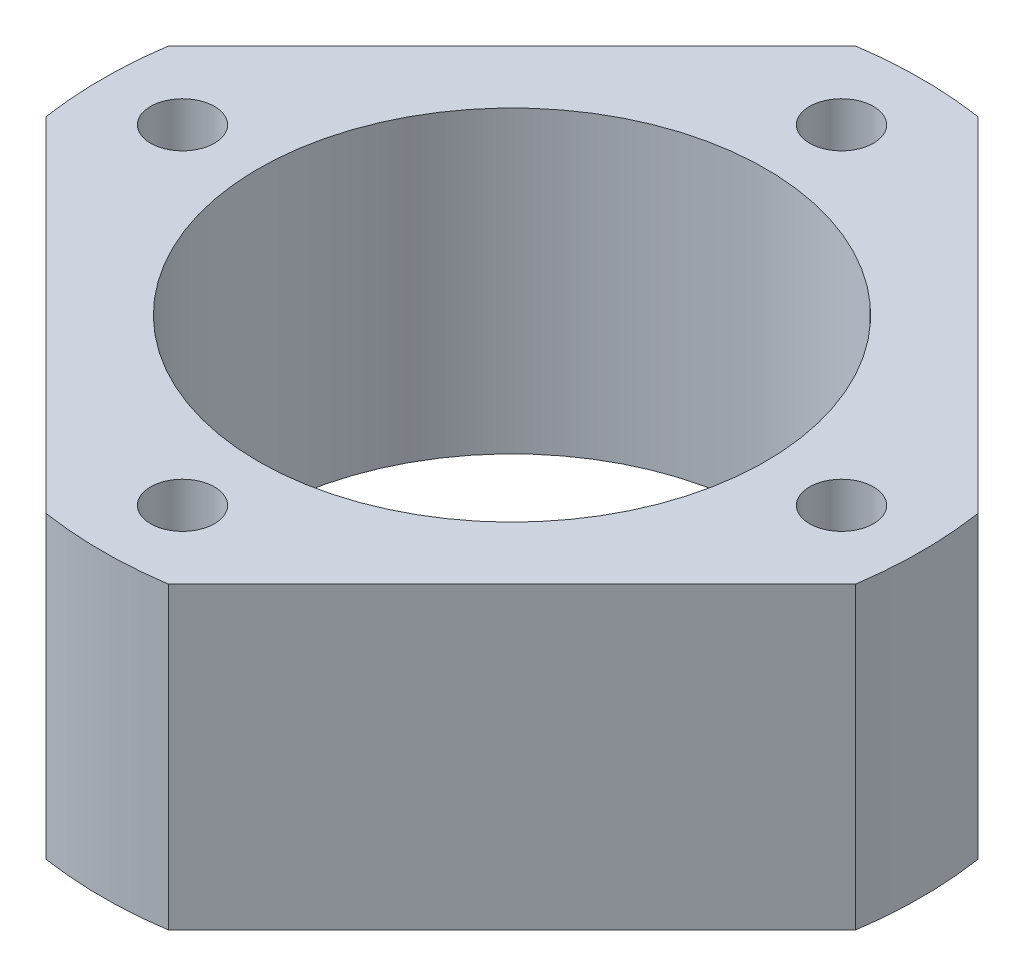
ISO-10303-21;
HEADER;
FILE_DESCRIPTION(('STEP AP214'),'2;1');
FILE_NAME('part.step','',(''),(''),'','','');
FILE_SCHEMA(('AUTOMOTIVE_DESIGN { 1 0 10303 214 1 1 1 1 }'));
ENDSEC;
DATA;
#1=APPLICATION_CONTEXT('core data for automotive mechanical design processes');
#2=APPLICATION_PROTOCOL_DEFINITION('international standard','automotive_design',2000,#1);
#3=PRODUCT_CONTEXT('',#1,'mechanical');
#4=PRODUCT('Part','Part','',(#3));
#5=PRODUCT_RELATED_PRODUCT_CATEGORY('part','',(#4));
#6=PRODUCT_DEFINITION_FORMATION('','',#4);
#7=PRODUCT_DEFINITION_CONTEXT('part definition',#1,'design');
#8=PRODUCT_DEFINITION('design','',#6,#7);
#9=PRODUCT_DEFINITION_SHAPE('','',#8);
#10=(LENGTH_UNIT() NAMED_UNIT(*) SI_UNIT(.MILLI.,.METRE.));
#11=(NAMED_UNIT(*) PLANE_ANGLE_UNIT() SI_UNIT($,.RADIAN.));
#12=(NAMED_UNIT(*) SI_UNIT($,.STERADIAN.) SOLID_ANGLE_UNIT());
#13=UNCERTAINTY_MEASURE_WITH_UNIT(LENGTH_MEASURE(1.E-05),#10,'distance_accuracy_value','');
#14=(GEOMETRIC_REPRESENTATION_CONTEXT(3) GLOBAL_UNCERTAINTY_ASSIGNED_CONTEXT((#13)) GLOBAL_UNIT_ASSIGNED_CONTEXT((#10,
#11,#12)) REPRESENTATION_CONTEXT('',''));
#15=CARTESIAN_POINT('',(0.,0.,0.));
#16=DIRECTION('',(0.,0.,1.));
#17=DIRECTION('',(1.,0.,0.));
#18=AXIS2_PLACEMENT_3D('',#15,#16,#17);
#19=CARTESIAN_POINT('',(11.6672618895781,15.,11.667261889578));
#20=DIRECTION('',(0.707106781186549,0.,0.707106781186546));
#21=DIRECTION('',(0.707106781186546,0.,-0.707106781186549));
#22=AXIS2_PLACEMENT_3D('',#19,#20,#21);
#23=PLANE('',#22);
#24=DIRECTION('',(-0.707106781186546,0.,0.707106781186549));
#25=VECTOR('',#24,1.);
#26=CARTESIAN_POINT('',(11.6672618895781,0.,11.667261889578));
#27=LINE('',#26,#25);
#28=CARTESIAN_POINT('',(20.2695871566207,0.,3.06493662253536));
#29=VERTEX_POINT('',#28);
#30=CARTESIAN_POINT('',(3.06493662253545,0.,20.2695871566207));
#31=VERTEX_POINT('',#30);
#32=EDGE_CURVE('E152',#29,#31,#27,.T.);
#33=ORIENTED_EDGE('',*,*,#32,.F.);
#34=DIRECTION('',(0.,-1.,0.));
#35=VECTOR('',#34,1.);
#36=CARTESIAN_POINT('',(20.2695871566207,15.,3.06493662253536));
#37=LINE('',#36,#35);
#38=CARTESIAN_POINT('',(20.2695871566207,15.,3.06493662253536));
#39=VERTEX_POINT('',#38);
#40=EDGE_CURVE('E11',#39,#29,#37,.T.);
#41=ORIENTED_EDGE('',*,*,#40,.F.);
#42=DIRECTION('',(-0.707106781186546,0.,0.707106781186549));
#43=VECTOR('',#42,1.);
#44=CARTESIAN_POINT('',(11.6672618895781,15.,11.667261889578));
#45=LINE('',#44,#43);
#46=CARTESIAN_POINT('',(3.06493662253545,15.,20.2695871566207));
#47=VERTEX_POINT('',#46);
#48=EDGE_CURVE('E209',#39,#47,#45,.T.);
#49=ORIENTED_EDGE('',*,*,#48,.T.);
#50=DIRECTION('',(0.,-1.,0.));
#51=VECTOR('',#50,1.);
#52=CARTESIAN_POINT('',(3.06493662253545,15.,20.2695871566207));
#53=LINE('',#52,#51);
#54=EDGE_CURVE('E92',#47,#31,#53,.T.);
#55=ORIENTED_EDGE('',*,*,#54,.T.);
#56=EDGE_LOOP('',(#33,#41,#49,#55));
#57=FACE_BOUND('',#56,.T.);
#58=ADVANCED_FACE('F41',(#57),#23,.T.);
#59=CARTESIAN_POINT('',(0.,15.,0.));
#60=DIRECTION('',(0.,-1.,0.));
#61=DIRECTION('',(0.,0.,-1.));
#62=AXIS2_PLACEMENT_3D('',#59,#60,#61);
#63=CYLINDRICAL_SURFACE('',#62,20.5);
#64=CARTESIAN_POINT('',(0.,0.,0.));
#65=DIRECTION('',(0.,1.,0.));
#66=DIRECTION('',(0.,0.,1.));
#67=AXIS2_PLACEMENT_3D('',#64,#65,#66);
#68=CIRCLE('',#67,20.5);
#69=CARTESIAN_POINT('',(20.2695871566207,0.,-3.06493662253545));
#70=VERTEX_POINT('',#69);
#71=EDGE_CURVE('E155',#29,#70,#68,.T.);
#72=ORIENTED_EDGE('',*,*,#71,.T.);
#73=DIRECTION('',(0.,-1.,0.));
#74=VECTOR('',#73,1.);
#75=CARTESIAN_POINT('',(20.2695871566207,15.,-3.06493662253545));
#76=LINE('',#75,#74);
#77=CARTESIAN_POINT('',(20.2695871566207,15.,-3.06493662253545));
#78=VERTEX_POINT('',#77);
#79=EDGE_CURVE('E50',#78,#70,#76,.T.);
#80=ORIENTED_EDGE('',*,*,#79,.F.);
#81=CARTESIAN_POINT('',(0.,15.,0.));
#82=DIRECTION('',(0.,1.,0.));
#83=DIRECTION('',(0.,0.,1.));
#84=AXIS2_PLACEMENT_3D('',#81,#82,#83);
#85=CIRCLE('',#84,20.5);
#86=EDGE_CURVE('E133',#39,#78,#85,.T.);
#87=ORIENTED_EDGE('',*,*,#86,.F.);
#88=ORIENTED_EDGE('',*,*,#40,.T.);
#89=EDGE_LOOP('',(#72,#80,#87,#88));
#90=FACE_BOUND('',#89,.T.);
#91=ADVANCED_FACE('F183',(#90),#63,.T.);
#92=CARTESIAN_POINT('',(11.667261889578,15.,-11.6672618895781));
#93=DIRECTION('',(0.707106781186546,0.,-0.707106781186549));
#94=DIRECTION('',(-0.707106781186549,0.,-0.707106781186546));
#95=AXIS2_PLACEMENT_3D('',#92,#93,#94);
#96=PLANE('',#95);
#97=DIRECTION('',(0.707106781186549,0.,0.707106781186546));
#98=VECTOR('',#97,1.);
#99=CARTESIAN_POINT('',(11.667261889578,0.,-11.6672618895781));
#100=LINE('',#99,#98);
#101=CARTESIAN_POINT('',(3.06493662253536,0.,-20.2695871566207));
#102=VERTEX_POINT('',#101);
#103=EDGE_CURVE('E158',#102,#70,#100,.T.);
#104=ORIENTED_EDGE('',*,*,#103,.F.);
#105=DIRECTION('',(0.,-1.,0.));
#106=VECTOR('',#105,1.);
#107=CARTESIAN_POINT('',(3.06493662253536,15.,-20.2695871566207));
#108=LINE('',#107,#106);
#109=CARTESIAN_POINT('',(3.06493662253536,15.,-20.2695871566207));
#110=VERTEX_POINT('',#109);
#111=EDGE_CURVE('E173',#110,#102,#108,.T.);
#112=ORIENTED_EDGE('',*,*,#111,.F.);
#113=DIRECTION('',(0.707106781186549,0.,0.707106781186546));
#114=VECTOR('',#113,1.);
#115=CARTESIAN_POINT('',(11.667261889578,15.,-11.6672618895781));
#116=LINE('',#115,#114);
#117=EDGE_CURVE('E180',#110,#78,#116,.T.);
#118=ORIENTED_EDGE('',*,*,#117,.T.);
#119=ORIENTED_EDGE('',*,*,#79,.T.);
#120=EDGE_LOOP('',(#104,#112,#118,#119));
#121=FACE_BOUND('',#120,.T.);
#122=ADVANCED_FACE('F178',(#121),#96,.T.);
#123=CARTESIAN_POINT('',(-3.06493662253545,0.,-20.2695871566207));
#124=VERTEX_POINT('',#123);
#125=EDGE_CURVE('E160',#102,#124,#68,.T.);
#126=ORIENTED_EDGE('',*,*,#125,.T.);
#127=DIRECTION('',(0.,-1.,0.));
#128=VECTOR('',#127,1.);
#129=CARTESIAN_POINT('',(-3.06493662253545,15.,-20.2695871566207));
#130=LINE('',#129,#128);
#131=CARTESIAN_POINT('',(-3.06493662253545,15.,-20.2695871566207));
#132=VERTEX_POINT('',#131);
#133=EDGE_CURVE('E171',#132,#124,#130,.T.);
#134=ORIENTED_EDGE('',*,*,#133,.F.);
#135=EDGE_CURVE('E120',#110,#132,#85,.T.);
#136=ORIENTED_EDGE('',*,*,#135,.F.);
#137=ORIENTED_EDGE('',*,*,#111,.T.);
#138=EDGE_LOOP('',(#126,#134,#136,#137));
#139=FACE_BOUND('',#138,.T.);
#140=ADVANCED_FACE('F219',(#139),#63,.T.);
#141=CARTESIAN_POINT('',(-11.6672618895781,15.,-11.667261889578));
#142=DIRECTION('',(-0.707106781186549,0.,-0.707106781186546));
#143=DIRECTION('',(-0.707106781186546,0.,0.707106781186549));
#144=AXIS2_PLACEMENT_3D('',#141,#142,#143);
#145=PLANE('',#144);
#146=DIRECTION('',(0.707106781186546,0.,-0.707106781186549));
#147=VECTOR('',#146,1.);
#148=CARTESIAN_POINT('',(-11.6672618895781,0.,-11.667261889578));
#149=LINE('',#148,#147);
#150=CARTESIAN_POINT('',(-20.2695871566207,0.,-3.06493662253537));
#151=VERTEX_POINT('',#150);
#152=EDGE_CURVE('E163',#151,#124,#149,.T.);
#153=ORIENTED_EDGE('',*,*,#152,.F.);
#154=DIRECTION('',(0.,-1.,0.));
#155=VECTOR('',#154,1.);
#156=CARTESIAN_POINT('',(-20.2695871566207,15.,-3.06493662253537));
#157=LINE('',#156,#155);
#158=CARTESIAN_POINT('',(-20.2695871566207,15.,-3.06493662253537));
#159=VERTEX_POINT('',#158);
#160=EDGE_CURVE('E129',#159,#151,#157,.T.);
#161=ORIENTED_EDGE('',*,*,#160,.F.);
#162=DIRECTION('',(0.707106781186546,0.,-0.707106781186549));
#163=VECTOR('',#162,1.);
#164=CARTESIAN_POINT('',(-11.6672618895781,15.,-11.667261889578));
#165=LINE('',#164,#163);
#166=EDGE_CURVE('E117',#159,#132,#165,.T.);
#167=ORIENTED_EDGE('',*,*,#166,.T.);
#168=ORIENTED_EDGE('',*,*,#133,.T.);
#169=EDGE_LOOP('',(#153,#161,#167,#168));
#170=FACE_BOUND('',#169,.T.);
#171=ADVANCED_FACE('F212',(#170),#145,.T.);
#172=CARTESIAN_POINT('',(-20.2695871566207,0.,3.06493662253546));
#173=VERTEX_POINT('',#172);
#174=EDGE_CURVE('E125',#151,#173,#68,.T.);
#175=ORIENTED_EDGE('',*,*,#174,.T.);
#176=DIRECTION('',(0.,-1.,0.));
#177=VECTOR('',#176,1.);
#178=CARTESIAN_POINT('',(-20.2695871566207,15.,3.06493662253546));
#179=LINE('',#178,#177);
#180=CARTESIAN_POINT('',(-20.2695871566207,15.,3.06493662253546));
#181=VERTEX_POINT('',#180);
#182=EDGE_CURVE('E122',#181,#173,#179,.T.);
#183=ORIENTED_EDGE('',*,*,#182,.F.);
#184=EDGE_CURVE('E111',#159,#181,#85,.T.);
#185=ORIENTED_EDGE('',*,*,#184,.F.);
#186=ORIENTED_EDGE('',*,*,#160,.T.);
#187=EDGE_LOOP('',(#175,#183,#185,#186));
#188=FACE_BOUND('',#187,.T.);
#189=ADVANCED_FACE('F123',(#188),#63,.T.);
#190=CARTESIAN_POINT('',(-11.667261889578,15.,11.6672618895781));
#191=DIRECTION('',(-0.707106781186546,0.,0.707106781186549));
#192=DIRECTION('',(0.707106781186549,0.,0.707106781186546));
#193=AXIS2_PLACEMENT_3D('',#190,#191,#192);
#194=PLANE('',#193);
#195=DIRECTION('',(-0.707106781186549,0.,-0.707106781186546));
#196=VECTOR('',#195,1.);
#197=CARTESIAN_POINT('',(-11.667261889578,0.,11.6672618895781));
#198=LINE('',#197,#196);
#199=CARTESIAN_POINT('',(-3.06493662253536,0.,20.2695871566207));
#200=VERTEX_POINT('',#199);
#201=EDGE_CURVE('E166',#200,#173,#198,.T.);
#202=ORIENTED_EDGE('',*,*,#201,.F.);
#203=DIRECTION('',(0.,-1.,0.));
#204=VECTOR('',#203,1.);
#205=CARTESIAN_POINT('',(-3.06493662253536,15.,20.2695871566207));
#206=LINE('',#205,#204);
#207=CARTESIAN_POINT('',(-3.06493662253536,15.,20.2695871566207));
#208=VERTEX_POINT('',#207);
#209=EDGE_CURVE('E85',#208,#200,#206,.T.);
#210=ORIENTED_EDGE('',*,*,#209,.F.);
#211=DIRECTION('',(-0.707106781186549,0.,-0.707106781186546));
#212=VECTOR('',#211,1.);
#213=CARTESIAN_POINT('',(-11.667261889578,15.,11.6672618895781));
#214=LINE('',#213,#212);
#215=EDGE_CURVE('E115',#208,#181,#214,.T.);
#216=ORIENTED_EDGE('',*,*,#215,.T.);
#217=ORIENTED_EDGE('',*,*,#182,.T.);
#218=EDGE_LOOP('',(#202,#210,#216,#217));
#219=FACE_BOUND('',#218,.T.);
#220=ADVANCED_FACE('F131',(#219),#194,.T.);
#221=CARTESIAN_POINT('',(0.,15.,0.));
#222=DIRECTION('',(0.,-1.,0.));
#223=DIRECTION('',(0.,0.,-1.));
#224=AXIS2_PLACEMENT_3D('',#221,#222,#223);
#225=CYLINDRICAL_SURFACE('',#224,12.7);
#226=CARTESIAN_POINT('',(0.,15.,0.));
#227=DIRECTION('',(0.,1.,0.));
#228=DIRECTION('',(0.,0.,1.));
#229=AXIS2_PLACEMENT_3D('',#226,#227,#228);
#230=CIRCLE('',#229,12.7);
#231=CARTESIAN_POINT('',(0.,15.,12.7));
#232=VERTEX_POINT('',#231);
#233=EDGE_CURVE('E206',#232,#232,#230,.T.);
#234=ORIENTED_EDGE('',*,*,#233,.T.);
#235=EDGE_LOOP('',(#234));
#236=FACE_BOUND('',#235,.T.);
#237=CARTESIAN_POINT('',(0.,0.,0.));
#238=DIRECTION('',(0.,1.,0.));
#239=DIRECTION('',(0.,0.,1.));
#240=AXIS2_PLACEMENT_3D('',#237,#238,#239);
#241=CIRCLE('',#240,12.7);
#242=CARTESIAN_POINT('',(0.,0.,12.7));
#243=VERTEX_POINT('',#242);
#244=EDGE_CURVE('E149',#243,#243,#241,.T.);
#245=ORIENTED_EDGE('',*,*,#244,.F.);
#246=EDGE_LOOP('',(#245));
#247=FACE_BOUND('',#246,.T.);
#248=ADVANCED_FACE('F224',(#236,#247),#225,.F.);
#249=CARTESIAN_POINT('',(0.,15.,-16.5));
#250=DIRECTION('',(0.,-1.,0.));
#251=DIRECTION('',(0.,0.,-1.));
#252=AXIS2_PLACEMENT_3D('',#249,#250,#251);
#253=CYLINDRICAL_SURFACE('',#252,1.6);
#254=CARTESIAN_POINT('',(0.,15.,-16.5));
#255=DIRECTION('',(0.,1.,0.));
#256=DIRECTION('',(0.,0.,1.));
#257=AXIS2_PLACEMENT_3D('',#254,#255,#256);
#258=CIRCLE('',#257,1.6);
#259=CARTESIAN_POINT('',(0.,15.,-14.9));
#260=VERTEX_POINT('',#259);
#261=EDGE_CURVE('E203',#260,#260,#258,.T.);
#262=ORIENTED_EDGE('',*,*,#261,.T.);
#263=EDGE_LOOP('',(#262));
#264=FACE_BOUND('',#263,.T.);
#265=CARTESIAN_POINT('',(0.,0.,-16.5));
#266=DIRECTION('',(0.,1.,0.));
#267=DIRECTION('',(0.,0.,1.));
#268=AXIS2_PLACEMENT_3D('',#265,#266,#267);
#269=CIRCLE('',#268,1.6);
#270=CARTESIAN_POINT('',(0.,0.,-14.9));
#271=VERTEX_POINT('',#270);
#272=EDGE_CURVE('E146',#271,#271,#269,.T.);
#273=ORIENTED_EDGE('',*,*,#272,.F.);
#274=EDGE_LOOP('',(#273));
#275=FACE_BOUND('',#274,.T.);
#276=ADVANCED_FACE('F227',(#264,#275),#253,.F.);
#277=CARTESIAN_POINT('',(16.5,15.,0.));
#278=DIRECTION('',(0.,-1.,0.));
#279=DIRECTION('',(0.,0.,-1.));
#280=AXIS2_PLACEMENT_3D('',#277,#278,#279);
#281=CYLINDRICAL_SURFACE('',#280,1.6);
#282=CARTESIAN_POINT('',(16.5,15.,0.));
#283=DIRECTION('',(0.,1.,0.));
#284=DIRECTION('',(0.,0.,1.));
#285=AXIS2_PLACEMENT_3D('',#282,#283,#284);
#286=CIRCLE('',#285,1.6);
#287=CARTESIAN_POINT('',(16.5,15.,1.6));
#288=VERTEX_POINT('',#287);
#289=EDGE_CURVE('E198',#288,#288,#286,.T.);
#290=ORIENTED_EDGE('',*,*,#289,.T.);
#291=EDGE_LOOP('',(#290));
#292=FACE_BOUND('',#291,.T.);
#293=CARTESIAN_POINT('',(16.5,0.,0.));
#294=DIRECTION('',(0.,1.,0.));
#295=DIRECTION('',(0.,0.,1.));
#296=AXIS2_PLACEMENT_3D('',#293,#294,#295);
#297=CIRCLE('',#296,1.6);
#298=CARTESIAN_POINT('',(16.5,0.,1.6));
#299=VERTEX_POINT('',#298);
#300=EDGE_CURVE('E143',#299,#299,#297,.T.);
#301=ORIENTED_EDGE('',*,*,#300,.F.);
#302=EDGE_LOOP('',(#301));
#303=FACE_BOUND('',#302,.T.);
#304=ADVANCED_FACE('F231',(#292,#303),#281,.F.);
#305=CARTESIAN_POINT('',(0.,15.,16.5));
#306=DIRECTION('',(0.,-1.,0.));
#307=DIRECTION('',(0.,0.,-1.));
#308=AXIS2_PLACEMENT_3D('',#305,#306,#307);
#309=CYLINDRICAL_SURFACE('',#308,1.6);
#310=CARTESIAN_POINT('',(0.,15.,16.5));
#311=DIRECTION('',(0.,1.,0.));
#312=DIRECTION('',(0.,0.,1.));
#313=AXIS2_PLACEMENT_3D('',#310,#311,#312);
#314=CIRCLE('',#313,1.6);
#315=CARTESIAN_POINT('',(0.,15.,18.1));
#316=VERTEX_POINT('',#315);
#317=EDGE_CURVE('E193',#316,#316,#314,.T.);
#318=ORIENTED_EDGE('',*,*,#317,.T.);
#319=EDGE_LOOP('',(#318));
#320=FACE_BOUND('',#319,.T.);
#321=CARTESIAN_POINT('',(0.,0.,16.5));
#322=DIRECTION('',(0.,1.,0.));
#323=DIRECTION('',(0.,0.,1.));
#324=AXIS2_PLACEMENT_3D('',#321,#322,#323);
#325=CIRCLE('',#324,1.6);
#326=CARTESIAN_POINT('',(0.,0.,18.1));
#327=VERTEX_POINT('',#326);
#328=EDGE_CURVE('E140',#327,#327,#325,.T.);
#329=ORIENTED_EDGE('',*,*,#328,.F.);
#330=EDGE_LOOP('',(#329));
#331=FACE_BOUND('',#330,.T.);
#332=ADVANCED_FACE('F234',(#320,#331),#309,.F.);
#333=CARTESIAN_POINT('',(-16.5,15.,0.));
#334=DIRECTION('',(0.,-1.,0.));
#335=DIRECTION('',(0.,0.,-1.));
#336=AXIS2_PLACEMENT_3D('',#333,#334,#335);
#337=CYLINDRICAL_SURFACE('',#336,1.6);
#338=CARTESIAN_POINT('',(-16.5,15.,0.));
#339=DIRECTION('',(0.,1.,0.));
#340=DIRECTION('',(0.,0.,1.));
#341=AXIS2_PLACEMENT_3D('',#338,#339,#340);
#342=CIRCLE('',#341,1.6);
#343=CARTESIAN_POINT('',(-16.5,15.,1.6));
#344=VERTEX_POINT('',#343);
#345=EDGE_CURVE('E191',#344,#344,#342,.T.);
#346=ORIENTED_EDGE('',*,*,#345,.T.);
#347=EDGE_LOOP('',(#346));
#348=FACE_BOUND('',#347,.T.);
#349=CARTESIAN_POINT('',(-16.5,0.,0.));
#350=DIRECTION('',(0.,1.,0.));
#351=DIRECTION('',(0.,0.,1.));
#352=AXIS2_PLACEMENT_3D('',#349,#350,#351);
#353=CIRCLE('',#352,1.6);
#354=CARTESIAN_POINT('',(-16.5,0.,1.6));
#355=VERTEX_POINT('',#354);
#356=EDGE_CURVE('E137',#355,#355,#353,.T.);
#357=ORIENTED_EDGE('',*,*,#356,.F.);
#358=EDGE_LOOP('',(#357));
#359=FACE_BOUND('',#358,.T.);
#360=ADVANCED_FACE('F43',(#348,#359),#337,.F.);
#361=EDGE_CURVE('E159',#200,#31,#68,.T.);
#362=ORIENTED_EDGE('',*,*,#361,.T.);
#363=ORIENTED_EDGE('',*,*,#54,.F.);
#364=EDGE_CURVE('E58',#208,#47,#85,.T.);
#365=ORIENTED_EDGE('',*,*,#364,.F.);
#366=ORIENTED_EDGE('',*,*,#209,.T.);
#367=EDGE_LOOP('',(#362,#363,#365,#366));
#368=FACE_BOUND('',#367,.T.);
#369=ADVANCED_FACE('F220',(#368),#63,.T.);
#370=CARTESIAN_POINT('',(0.,15.,0.));
#371=DIRECTION('',(0.,1.,0.));
#372=DIRECTION('',(0.,0.,1.));
#373=AXIS2_PLACEMENT_3D('',#370,#371,#372);
#374=PLANE('',#373);
#375=ORIENTED_EDGE('',*,*,#345,.F.);
#376=EDGE_LOOP('',(#375));
#377=FACE_BOUND('',#376,.T.);
#378=ORIENTED_EDGE('',*,*,#317,.F.);
#379=EDGE_LOOP('',(#378));
#380=FACE_BOUND('',#379,.T.);
#381=ORIENTED_EDGE('',*,*,#289,.F.);
#382=EDGE_LOOP('',(#381));
#383=FACE_BOUND('',#382,.T.);
#384=ORIENTED_EDGE('',*,*,#261,.F.);
#385=EDGE_LOOP('',(#384));
#386=FACE_BOUND('',#385,.T.);
#387=ORIENTED_EDGE('',*,*,#233,.F.);
#388=EDGE_LOOP('',(#387));
#389=FACE_BOUND('',#388,.T.);
#390=ORIENTED_EDGE('',*,*,#48,.F.);
#391=ORIENTED_EDGE('',*,*,#86,.T.);
#392=ORIENTED_EDGE('',*,*,#117,.F.);
#393=ORIENTED_EDGE('',*,*,#135,.T.);
#394=ORIENTED_EDGE('',*,*,#166,.F.);
#395=ORIENTED_EDGE('',*,*,#184,.T.);
#396=ORIENTED_EDGE('',*,*,#215,.F.);
#397=ORIENTED_EDGE('',*,*,#364,.T.);
#398=EDGE_LOOP('',(#390,#391,#392,#393,#394,#395,#396,#397));
#399=FACE_BOUND('',#398,.T.);
#400=ADVANCED_FACE('F113',(#377,#380,#383,#386,#389,#399),#374,.T.);
#401=CARTESIAN_POINT('',(0.,0.,0.));
#402=DIRECTION('',(0.,1.,0.));
#403=DIRECTION('',(0.,0.,1.));
#404=AXIS2_PLACEMENT_3D('',#401,#402,#403);
#405=PLANE('',#404);
#406=ORIENTED_EDGE('',*,*,#356,.T.);
#407=EDGE_LOOP('',(#406));
#408=FACE_BOUND('',#407,.T.);
#409=ORIENTED_EDGE('',*,*,#328,.T.);
#410=EDGE_LOOP('',(#409));
#411=FACE_BOUND('',#410,.T.);
#412=ORIENTED_EDGE('',*,*,#300,.T.);
#413=EDGE_LOOP('',(#412));
#414=FACE_BOUND('',#413,.T.);
#415=ORIENTED_EDGE('',*,*,#272,.T.);
#416=EDGE_LOOP('',(#415));
#417=FACE_BOUND('',#416,.T.);
#418=ORIENTED_EDGE('',*,*,#244,.T.);
#419=EDGE_LOOP('',(#418));
#420=FACE_BOUND('',#419,.T.);
#421=ORIENTED_EDGE('',*,*,#32,.T.);
#422=ORIENTED_EDGE('',*,*,#361,.F.);
#423=ORIENTED_EDGE('',*,*,#201,.T.);
#424=ORIENTED_EDGE('',*,*,#174,.F.);
#425=ORIENTED_EDGE('',*,*,#152,.T.);
#426=ORIENTED_EDGE('',*,*,#125,.F.);
#427=ORIENTED_EDGE('',*,*,#103,.T.);
#428=ORIENTED_EDGE('',*,*,#71,.F.);
#429=EDGE_LOOP('',(#421,#422,#423,#424,#425,#426,#427,#428));
#430=FACE_BOUND('',#429,.T.);
#431=ADVANCED_FACE('F186',(#408,#411,#414,#417,#420,#430),#405,.F.);
#432=CLOSED_SHELL('',(#58,#91,#122,#140,#171,#189,#220,#248,#276,#304,#332,#360,#369,#400,#431));
#433=MANIFOLD_SOLID_BREP('B2',#432);
#434=ADVANCED_BREP_SHAPE_REPRESENTATION('',(#18,#433),#14);
#435=SHAPE_DEFINITION_REPRESENTATION(#9,#434);
ENDSEC;
END-ISO-10303-21;
